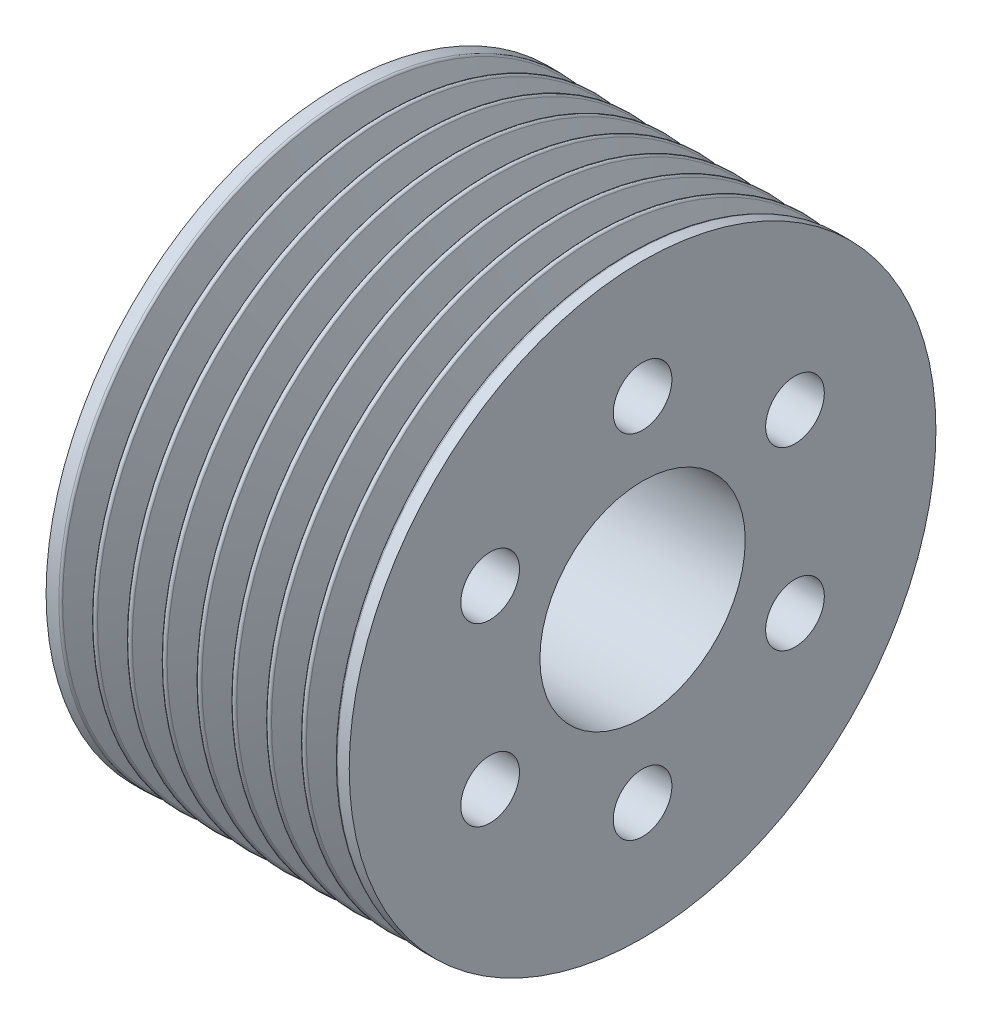
ISO-10303-21;
HEADER;
FILE_DESCRIPTION(('STEP AP214'),'2;1');
FILE_NAME('part.step','',(''),(''),'','','');
FILE_SCHEMA(('AUTOMOTIVE_DESIGN { 1 0 10303 214 1 1 1 1 }'));
ENDSEC;
DATA;
#1=APPLICATION_CONTEXT('core data for automotive mechanical design processes');
#2=APPLICATION_PROTOCOL_DEFINITION('international standard','automotive_design',2000,#1);
#3=PRODUCT_CONTEXT('',#1,'mechanical');
#4=PRODUCT('Part','Part','',(#3));
#5=PRODUCT_RELATED_PRODUCT_CATEGORY('part','',(#4));
#6=PRODUCT_DEFINITION_FORMATION('','',#4);
#7=PRODUCT_DEFINITION_CONTEXT('part definition',#1,'design');
#8=PRODUCT_DEFINITION('design','',#6,#7);
#9=PRODUCT_DEFINITION_SHAPE('','',#8);
#10=(LENGTH_UNIT() NAMED_UNIT(*) SI_UNIT(.MILLI.,.METRE.));
#11=(NAMED_UNIT(*) PLANE_ANGLE_UNIT() SI_UNIT($,.RADIAN.));
#12=(NAMED_UNIT(*) SI_UNIT($,.STERADIAN.) SOLID_ANGLE_UNIT());
#13=UNCERTAINTY_MEASURE_WITH_UNIT(LENGTH_MEASURE(1.E-05),#10,'distance_accuracy_value','');
#14=(GEOMETRIC_REPRESENTATION_CONTEXT(3) GLOBAL_UNCERTAINTY_ASSIGNED_CONTEXT((#13)) GLOBAL_UNIT_ASSIGNED_CONTEXT((#10,
#11,#12)) REPRESENTATION_CONTEXT('',''));
#15=CARTESIAN_POINT('',(0.,0.,0.));
#16=DIRECTION('',(0.,0.,1.));
#17=DIRECTION('',(1.,0.,0.));
#18=AXIS2_PLACEMENT_3D('',#15,#16,#17);
#19=CARTESIAN_POINT('',(0.,0.,0.));
#20=DIRECTION('',(-1.,0.,0.));
#21=DIRECTION('',(0.,0.,1.));
#22=AXIS2_PLACEMENT_3D('',#19,#20,#21);
#23=CYLINDRICAL_SURFACE('',#22,30.);
#24=CARTESIAN_POINT('',(18.,0.,0.));
#25=DIRECTION('',(-1.,0.,0.));
#26=DIRECTION('',(0.,0.,1.));
#27=AXIS2_PLACEMENT_3D('',#24,#25,#26);
#28=CIRCLE('',#27,30.);
#29=CARTESIAN_POINT('',(18.,0.,30.));
#30=VERTEX_POINT('',#29);
#31=EDGE_CURVE('E54',#30,#30,#28,.T.);
#32=ORIENTED_EDGE('',*,*,#31,.F.);
#33=EDGE_LOOP('',(#32));
#34=FACE_BOUND('',#33,.T.);
#35=CARTESIAN_POINT('',(19.3,0.,0.));
#36=DIRECTION('',(-1.,0.,0.));
#37=DIRECTION('',(0.,0.,1.));
#38=AXIS2_PLACEMENT_3D('',#35,#36,#37);
#39=CIRCLE('',#38,30.);
#40=CARTESIAN_POINT('',(19.3,0.,30.));
#41=VERTEX_POINT('',#40);
#42=EDGE_CURVE('E205',#41,#41,#39,.T.);
#43=ORIENTED_EDGE('',*,*,#42,.T.);
#44=EDGE_LOOP('',(#43));
#45=FACE_BOUND('',#44,.T.);
#46=ADVANCED_FACE('F41',(#34,#45),#23,.T.);
#47=CARTESIAN_POINT('',(31.5,10.5,0.));
#48=DIRECTION('',(1.,0.,0.));
#49=DIRECTION('',(0.,0.,-1.));
#50=AXIS2_PLACEMENT_3D('',#47,#48,#49);
#51=PLANE('',#50);
#52=CARTESIAN_POINT('',(31.5,8.99999999999998,15.5884572681199));
#53=DIRECTION('',(1.,0.,0.));
#54=DIRECTION('',(0.,0.,-1.));
#55=AXIS2_PLACEMENT_3D('',#52,#53,#54);
#56=CIRCLE('',#55,3.);
#57=CARTESIAN_POINT('',(31.5,8.99999999999998,12.5884572681199));
#58=VERTEX_POINT('',#57);
#59=EDGE_CURVE('E249',#58,#58,#56,.F.);
#60=ORIENTED_EDGE('',*,*,#59,.F.);
#61=EDGE_LOOP('',(#60));
#62=FACE_BOUND('',#61,.T.);
#63=CARTESIAN_POINT('',(31.5,-9.00000000000001,15.5884572681199));
#64=DIRECTION('',(1.,0.,0.));
#65=DIRECTION('',(0.,0.,-1.));
#66=AXIS2_PLACEMENT_3D('',#63,#64,#65);
#67=CIRCLE('',#66,3.);
#68=CARTESIAN_POINT('',(31.5,-9.00000000000001,12.5884572681199));
#69=VERTEX_POINT('',#68);
#70=EDGE_CURVE('E241',#69,#69,#67,.F.);
#71=ORIENTED_EDGE('',*,*,#70,.F.);
#72=EDGE_LOOP('',(#71));
#73=FACE_BOUND('',#72,.T.);
#74=CARTESIAN_POINT('',(31.5,-18.,0.));
#75=DIRECTION('',(1.,0.,0.));
#76=DIRECTION('',(0.,0.,-1.));
#77=AXIS2_PLACEMENT_3D('',#74,#75,#76);
#78=CIRCLE('',#77,3.);
#79=CARTESIAN_POINT('',(31.5,-18.,-3.00000000000001));
#80=VERTEX_POINT('',#79);
#81=EDGE_CURVE('E233',#80,#80,#78,.F.);
#82=ORIENTED_EDGE('',*,*,#81,.F.);
#83=EDGE_LOOP('',(#82));
#84=FACE_BOUND('',#83,.T.);
#85=CARTESIAN_POINT('',(31.5,-8.99999999999999,-15.5884572681199));
#86=DIRECTION('',(1.,0.,0.));
#87=DIRECTION('',(0.,0.,-1.));
#88=AXIS2_PLACEMENT_3D('',#85,#86,#87);
#89=CIRCLE('',#88,3.);
#90=CARTESIAN_POINT('',(31.5,-8.99999999999999,-18.5884572681199));
#91=VERTEX_POINT('',#90);
#92=EDGE_CURVE('E225',#91,#91,#89,.F.);
#93=ORIENTED_EDGE('',*,*,#92,.F.);
#94=EDGE_LOOP('',(#93));
#95=FACE_BOUND('',#94,.T.);
#96=CARTESIAN_POINT('',(31.5,9.00000000000001,-15.5884572681199));
#97=DIRECTION('',(1.,0.,0.));
#98=DIRECTION('',(0.,0.,-1.));
#99=AXIS2_PLACEMENT_3D('',#96,#97,#98);
#100=CIRCLE('',#99,3.);
#101=CARTESIAN_POINT('',(31.5,9.00000000000001,-18.5884572681199));
#102=VERTEX_POINT('',#101);
#103=EDGE_CURVE('E217',#102,#102,#100,.F.);
#104=ORIENTED_EDGE('',*,*,#103,.F.);
#105=EDGE_LOOP('',(#104));
#106=FACE_BOUND('',#105,.T.);
#107=CARTESIAN_POINT('',(31.5,18.,0.));
#108=DIRECTION('',(1.,0.,0.));
#109=DIRECTION('',(0.,0.,-1.));
#110=AXIS2_PLACEMENT_3D('',#107,#108,#109);
#111=CIRCLE('',#110,3.);
#112=CARTESIAN_POINT('',(31.5,18.,-3.));
#113=VERTEX_POINT('',#112);
#114=EDGE_CURVE('E209',#113,#113,#111,.F.);
#115=ORIENTED_EDGE('',*,*,#114,.F.);
#116=EDGE_LOOP('',(#115));
#117=FACE_BOUND('',#116,.T.);
#118=CARTESIAN_POINT('',(31.5,0.,0.));
#119=DIRECTION('',(-1.,0.,0.));
#120=DIRECTION('',(0.,0.,1.));
#121=AXIS2_PLACEMENT_3D('',#118,#119,#120);
#122=CIRCLE('',#121,10.5);
#123=CARTESIAN_POINT('',(31.5,0.,10.5));
#124=VERTEX_POINT('',#123);
#125=EDGE_CURVE('E69',#124,#124,#122,.T.);
#126=ORIENTED_EDGE('',*,*,#125,.F.);
#127=EDGE_LOOP('',(#126));
#128=FACE_BOUND('',#127,.T.);
#129=CARTESIAN_POINT('',(31.5,0.,0.));
#130=DIRECTION('',(-1.,0.,0.));
#131=DIRECTION('',(0.,0.,1.));
#132=AXIS2_PLACEMENT_3D('',#129,#130,#131);
#133=CIRCLE('',#132,21.5);
#134=CARTESIAN_POINT('',(31.5,0.,21.5));
#135=VERTEX_POINT('',#134);
#136=EDGE_CURVE('E10',#135,#135,#133,.T.);
#137=ORIENTED_EDGE('',*,*,#136,.T.);
#138=EDGE_LOOP('',(#137));
#139=FACE_BOUND('',#138,.T.);
#140=ADVANCED_FACE('F43',(#62,#73,#84,#95,#106,#117,#128,#139),#51,.F.);
#141=CARTESIAN_POINT('',(0.,0.,0.));
#142=DIRECTION('',(-1.,0.,0.));
#143=DIRECTION('',(0.,0.,1.));
#144=AXIS2_PLACEMENT_3D('',#141,#142,#143);
#145=CYLINDRICAL_SURFACE('',#144,21.5);
#146=ORIENTED_EDGE('',*,*,#136,.F.);
#147=EDGE_LOOP('',(#146));
#148=FACE_BOUND('',#147,.T.);
#149=CARTESIAN_POINT('',(18.,0.,0.));
#150=DIRECTION('',(-1.,0.,0.));
#151=DIRECTION('',(0.,0.,1.));
#152=AXIS2_PLACEMENT_3D('',#149,#150,#151);
#153=CIRCLE('',#152,21.5);
#154=CARTESIAN_POINT('',(18.,0.,21.5));
#155=VERTEX_POINT('',#154);
#156=EDGE_CURVE('E49',#155,#155,#153,.T.);
#157=ORIENTED_EDGE('',*,*,#156,.T.);
#158=EDGE_LOOP('',(#157));
#159=FACE_BOUND('',#158,.T.);
#160=ADVANCED_FACE('F287',(#148,#159),#145,.F.);
#161=CARTESIAN_POINT('',(18.,30.,0.));
#162=DIRECTION('',(1.,0.,0.));
#163=DIRECTION('',(0.,0.,-1.));
#164=AXIS2_PLACEMENT_3D('',#161,#162,#163);
#165=PLANE('',#164);
#166=ORIENTED_EDGE('',*,*,#156,.F.);
#167=EDGE_LOOP('',(#166));
#168=FACE_BOUND('',#167,.T.);
#169=ORIENTED_EDGE('',*,*,#31,.T.);
#170=EDGE_LOOP('',(#169));
#171=FACE_BOUND('',#170,.T.);
#172=ADVANCED_FACE('F293',(#168,#171),#165,.F.);
#173=CARTESIAN_POINT('',(47.78,0.,0.));
#174=DIRECTION('',(-1.,0.,0.));
#175=DIRECTION('',(0.,0.,1.));
#176=AXIS2_PLACEMENT_3D('',#173,#174,#175);
#177=CIRCLE('',#176,30.);
#178=CARTESIAN_POINT('',(47.78,0.,30.));
#179=VERTEX_POINT('',#178);
#180=EDGE_CURVE('E89',#179,#179,#177,.T.);
#181=ORIENTED_EDGE('',*,*,#180,.F.);
#182=EDGE_LOOP('',(#181));
#183=FACE_BOUND('',#182,.T.);
#184=CARTESIAN_POINT('',(49.,0.,0.));
#185=DIRECTION('',(-1.,0.,0.));
#186=DIRECTION('',(0.,0.,1.));
#187=AXIS2_PLACEMENT_3D('',#184,#185,#186);
#188=CIRCLE('',#187,30.);
#189=CARTESIAN_POINT('',(49.,0.,30.));
#190=VERTEX_POINT('',#189);
#191=EDGE_CURVE('E59',#190,#190,#188,.T.);
#192=ORIENTED_EDGE('',*,*,#191,.T.);
#193=EDGE_LOOP('',(#192));
#194=FACE_BOUND('',#193,.T.);
#195=ADVANCED_FACE('F264',(#183,#194),#23,.T.);
#196=CARTESIAN_POINT('',(49.,10.5,0.));
#197=DIRECTION('',(-1.,0.,0.));
#198=DIRECTION('',(0.,0.,1.));
#199=AXIS2_PLACEMENT_3D('',#196,#197,#198);
#200=PLANE('',#199);
#201=CARTESIAN_POINT('',(49.,8.99999999999998,15.5884572681199));
#202=DIRECTION('',(1.,0.,0.));
#203=DIRECTION('',(0.,0.,-1.));
#204=AXIS2_PLACEMENT_3D('',#201,#202,#203);
#205=CIRCLE('',#204,3.);
#206=CARTESIAN_POINT('',(49.,8.99999999999998,12.5884572681199));
#207=VERTEX_POINT('',#206);
#208=EDGE_CURVE('E253',#207,#207,#205,.T.);
#209=ORIENTED_EDGE('',*,*,#208,.F.);
#210=EDGE_LOOP('',(#209));
#211=FACE_BOUND('',#210,.T.);
#212=CARTESIAN_POINT('',(49.,-9.00000000000001,15.5884572681199));
#213=DIRECTION('',(1.,0.,0.));
#214=DIRECTION('',(0.,0.,-1.));
#215=AXIS2_PLACEMENT_3D('',#212,#213,#214);
#216=CIRCLE('',#215,3.);
#217=CARTESIAN_POINT('',(49.,-9.00000000000001,12.5884572681199));
#218=VERTEX_POINT('',#217);
#219=EDGE_CURVE('E245',#218,#218,#216,.T.);
#220=ORIENTED_EDGE('',*,*,#219,.F.);
#221=EDGE_LOOP('',(#220));
#222=FACE_BOUND('',#221,.T.);
#223=CARTESIAN_POINT('',(49.,-18.,0.));
#224=DIRECTION('',(1.,0.,0.));
#225=DIRECTION('',(0.,0.,-1.));
#226=AXIS2_PLACEMENT_3D('',#223,#224,#225);
#227=CIRCLE('',#226,3.);
#228=CARTESIAN_POINT('',(49.,-18.,-3.00000000000001));
#229=VERTEX_POINT('',#228);
#230=EDGE_CURVE('E237',#229,#229,#227,.T.);
#231=ORIENTED_EDGE('',*,*,#230,.F.);
#232=EDGE_LOOP('',(#231));
#233=FACE_BOUND('',#232,.T.);
#234=CARTESIAN_POINT('',(49.,-8.99999999999999,-15.5884572681199));
#235=DIRECTION('',(1.,0.,0.));
#236=DIRECTION('',(0.,0.,-1.));
#237=AXIS2_PLACEMENT_3D('',#234,#235,#236);
#238=CIRCLE('',#237,3.);
#239=CARTESIAN_POINT('',(49.,-8.99999999999999,-18.5884572681199));
#240=VERTEX_POINT('',#239);
#241=EDGE_CURVE('E229',#240,#240,#238,.T.);
#242=ORIENTED_EDGE('',*,*,#241,.F.);
#243=EDGE_LOOP('',(#242));
#244=FACE_BOUND('',#243,.T.);
#245=CARTESIAN_POINT('',(49.,9.00000000000001,-15.5884572681199));
#246=DIRECTION('',(1.,0.,0.));
#247=DIRECTION('',(0.,0.,-1.));
#248=AXIS2_PLACEMENT_3D('',#245,#246,#247);
#249=CIRCLE('',#248,3.);
#250=CARTESIAN_POINT('',(49.,9.00000000000001,-18.5884572681199));
#251=VERTEX_POINT('',#250);
#252=EDGE_CURVE('E221',#251,#251,#249,.T.);
#253=ORIENTED_EDGE('',*,*,#252,.F.);
#254=EDGE_LOOP('',(#253));
#255=FACE_BOUND('',#254,.T.);
#256=CARTESIAN_POINT('',(49.,18.,0.));
#257=DIRECTION('',(1.,0.,0.));
#258=DIRECTION('',(0.,0.,-1.));
#259=AXIS2_PLACEMENT_3D('',#256,#257,#258);
#260=CIRCLE('',#259,3.);
#261=CARTESIAN_POINT('',(49.,18.,-3.));
#262=VERTEX_POINT('',#261);
#263=EDGE_CURVE('E213',#262,#262,#260,.T.);
#264=ORIENTED_EDGE('',*,*,#263,.F.);
#265=EDGE_LOOP('',(#264));
#266=FACE_BOUND('',#265,.T.);
#267=ORIENTED_EDGE('',*,*,#191,.F.);
#268=EDGE_LOOP('',(#267));
#269=FACE_BOUND('',#268,.T.);
#270=CARTESIAN_POINT('',(49.,0.,0.));
#271=DIRECTION('',(-1.,0.,0.));
#272=DIRECTION('',(0.,0.,1.));
#273=AXIS2_PLACEMENT_3D('',#270,#271,#272);
#274=CIRCLE('',#273,10.5);
#275=CARTESIAN_POINT('',(49.,0.,10.5));
#276=VERTEX_POINT('',#275);
#277=EDGE_CURVE('E65',#276,#276,#274,.T.);
#278=ORIENTED_EDGE('',*,*,#277,.T.);
#279=EDGE_LOOP('',(#278));
#280=FACE_BOUND('',#279,.T.);
#281=ADVANCED_FACE('F260',(#211,#222,#233,#244,#255,#266,#269,#280),#200,.F.);
#282=CARTESIAN_POINT('',(0.,0.,0.));
#283=DIRECTION('',(-1.,0.,0.));
#284=DIRECTION('',(0.,0.,1.));
#285=AXIS2_PLACEMENT_3D('',#282,#283,#284);
#286=CYLINDRICAL_SURFACE('',#285,10.5);
#287=ORIENTED_EDGE('',*,*,#277,.F.);
#288=EDGE_LOOP('',(#287));
#289=FACE_BOUND('',#288,.T.);
#290=ORIENTED_EDGE('',*,*,#125,.T.);
#291=EDGE_LOOP('',(#290));
#292=FACE_BOUND('',#291,.T.);
#293=ADVANCED_FACE('F263',(#289,#292),#286,.F.);
#294=CARTESIAN_POINT('',(47.78,0.,0.));
#295=DIRECTION('',(-1.,0.,0.));
#296=DIRECTION('',(0.,0.,1.));
#297=AXIS2_PLACEMENT_3D('',#294,#295,#296);
#298=TOROIDAL_SURFACE('',#297,29.75,0.249999999999997);
#299=ORIENTED_EDGE('',*,*,#180,.T.);
#300=EDGE_LOOP('',(#299));
#301=FACE_BOUND('',#300,.T.);
#302=CARTESIAN_POINT('',(47.5458319526879,0.,0.));
#303=DIRECTION('',(-1.,0.,0.));
#304=DIRECTION('',(0.,0.,1.));
#305=AXIS2_PLACEMENT_3D('',#302,#303,#304);
#306=CIRCLE('',#305,29.8375518453149);
#307=CARTESIAN_POINT('',(47.5458319526879,0.,29.8375518453149));
#308=VERTEX_POINT('',#307);
#309=EDGE_CURVE('E73',#308,#308,#306,.T.);
#310=ORIENTED_EDGE('',*,*,#309,.F.);
#311=EDGE_LOOP('',(#310));
#312=FACE_BOUND('',#311,.T.);
#313=ADVANCED_FACE('F282',(#301,#312),#298,.T.);
#314=CARTESIAN_POINT('',(46.2810016567745,0.,0.));
#315=DIRECTION('',(1.,0.,0.));
#316=DIRECTION('',(0.,0.,-1.));
#317=AXIS2_PLACEMENT_3D('',#314,#315,#316);
#318=CONICAL_SURFACE('',#317,26.4546095496951,1.21300383013606);
#319=ORIENTED_EDGE('',*,*,#309,.T.);
#320=EDGE_LOOP('',(#319));
#321=FACE_BOUND('',#320,.T.);
#322=CARTESIAN_POINT('',(46.2810016567745,0.,0.));
#323=DIRECTION('',(-1.,0.,0.));
#324=DIRECTION('',(0.,0.,1.));
#325=AXIS2_PLACEMENT_3D('',#322,#323,#324);
#326=CIRCLE('',#325,26.4546095496951);
#327=CARTESIAN_POINT('',(46.2810016567745,0.,26.4546095496951));
#328=VERTEX_POINT('',#327);
#329=EDGE_CURVE('E77',#328,#328,#326,.T.);
#330=ORIENTED_EDGE('',*,*,#329,.F.);
#331=EDGE_LOOP('',(#330));
#332=FACE_BOUND('',#331,.T.);
#333=ADVANCED_FACE('F445',(#321,#332),#318,.T.);
#334=CARTESIAN_POINT('',(46.,0.,0.));
#335=DIRECTION('',(-1.,0.,0.));
#336=DIRECTION('',(0.,0.,1.));
#337=AXIS2_PLACEMENT_3D('',#334,#335,#336);
#338=TOROIDAL_SURFACE('',#337,26.5596717640729,0.300000000000001);
#339=ORIENTED_EDGE('',*,*,#329,.T.);
#340=EDGE_LOOP('',(#339));
#341=FACE_BOUND('',#340,.T.);
#342=CARTESIAN_POINT('',(45.7189983432255,0.,0.));
#343=DIRECTION('',(-1.,0.,0.));
#344=DIRECTION('',(0.,0.,1.));
#345=AXIS2_PLACEMENT_3D('',#342,#343,#344);
#346=CIRCLE('',#345,26.4546095496951);
#347=CARTESIAN_POINT('',(45.7189983432255,0.,26.4546095496951));
#348=VERTEX_POINT('',#347);
#349=EDGE_CURVE('E81',#348,#348,#346,.T.);
#350=ORIENTED_EDGE('',*,*,#349,.F.);
#351=EDGE_LOOP('',(#350));
#352=FACE_BOUND('',#351,.T.);
#353=ADVANCED_FACE('F441',(#341,#352),#338,.F.);
#354=CARTESIAN_POINT('',(44.4541680473121,0.,0.));
#355=DIRECTION('',(-1.,0.,0.));
#356=DIRECTION('',(0.,0.,1.));
#357=AXIS2_PLACEMENT_3D('',#354,#355,#356);
#358=CONICAL_SURFACE('',#357,29.8375518453149,1.21300383013606);
#359=ORIENTED_EDGE('',*,*,#349,.T.);
#360=EDGE_LOOP('',(#359));
#361=FACE_BOUND('',#360,.T.);
#362=CARTESIAN_POINT('',(44.4541680473121,0.,0.));
#363=DIRECTION('',(-1.,0.,0.));
#364=DIRECTION('',(0.,0.,1.));
#365=AXIS2_PLACEMENT_3D('',#362,#363,#364);
#366=CIRCLE('',#365,29.8375518453149);
#367=CARTESIAN_POINT('',(44.4541680473121,0.,29.8375518453149));
#368=VERTEX_POINT('',#367);
#369=EDGE_CURVE('E85',#368,#368,#366,.T.);
#370=ORIENTED_EDGE('',*,*,#369,.F.);
#371=EDGE_LOOP('',(#370));
#372=FACE_BOUND('',#371,.T.);
#373=ADVANCED_FACE('F437',(#361,#372),#358,.T.);
#374=CARTESIAN_POINT('',(44.22,0.,0.));
#375=DIRECTION('',(-1.,0.,0.));
#376=DIRECTION('',(0.,0.,1.));
#377=AXIS2_PLACEMENT_3D('',#374,#375,#376);
#378=TOROIDAL_SURFACE('',#377,29.75,0.250000000000004);
#379=ORIENTED_EDGE('',*,*,#369,.T.);
#380=EDGE_LOOP('',(#379));
#381=FACE_BOUND('',#380,.T.);
#382=CARTESIAN_POINT('',(43.9858319526879,0.,0.));
#383=DIRECTION('',(-1.,0.,0.));
#384=DIRECTION('',(0.,0.,1.));
#385=AXIS2_PLACEMENT_3D('',#382,#383,#384);
#386=CIRCLE('',#385,29.8375518453149);
#387=CARTESIAN_POINT('',(43.9858319526879,0.,29.8375518453149));
#388=VERTEX_POINT('',#387);
#389=EDGE_CURVE('E93',#388,#388,#386,.T.);
#390=ORIENTED_EDGE('',*,*,#389,.F.);
#391=EDGE_LOOP('',(#390));
#392=FACE_BOUND('',#391,.T.);
#393=ADVANCED_FACE('F433',(#381,#392),#378,.T.);
#394=CARTESIAN_POINT('',(42.7210016567745,0.,0.));
#395=DIRECTION('',(1.,0.,0.));
#396=DIRECTION('',(0.,0.,-1.));
#397=AXIS2_PLACEMENT_3D('',#394,#395,#396);
#398=CONICAL_SURFACE('',#397,26.4546095496951,1.21300383013606);
#399=ORIENTED_EDGE('',*,*,#389,.T.);
#400=EDGE_LOOP('',(#399));
#401=FACE_BOUND('',#400,.T.);
#402=CARTESIAN_POINT('',(42.7210016567745,0.,0.));
#403=DIRECTION('',(-1.,0.,0.));
#404=DIRECTION('',(0.,0.,1.));
#405=AXIS2_PLACEMENT_3D('',#402,#403,#404);
#406=CIRCLE('',#405,26.4546095496951);
#407=CARTESIAN_POINT('',(42.7210016567745,0.,26.4546095496951));
#408=VERTEX_POINT('',#407);
#409=EDGE_CURVE('E97',#408,#408,#406,.T.);
#410=ORIENTED_EDGE('',*,*,#409,.F.);
#411=EDGE_LOOP('',(#410));
#412=FACE_BOUND('',#411,.T.);
#413=ADVANCED_FACE('F429',(#401,#412),#398,.T.);
#414=CARTESIAN_POINT('',(42.44,0.,0.));
#415=DIRECTION('',(-1.,0.,0.));
#416=DIRECTION('',(0.,0.,1.));
#417=AXIS2_PLACEMENT_3D('',#414,#415,#416);
#418=TOROIDAL_SURFACE('',#417,26.5596717640729,0.300000000000001);
#419=ORIENTED_EDGE('',*,*,#409,.T.);
#420=EDGE_LOOP('',(#419));
#421=FACE_BOUND('',#420,.T.);
#422=CARTESIAN_POINT('',(42.1589983432255,0.,0.));
#423=DIRECTION('',(-1.,0.,0.));
#424=DIRECTION('',(0.,0.,1.));
#425=AXIS2_PLACEMENT_3D('',#422,#423,#424);
#426=CIRCLE('',#425,26.4546095496951);
#427=CARTESIAN_POINT('',(42.1589983432255,0.,26.4546095496951));
#428=VERTEX_POINT('',#427);
#429=EDGE_CURVE('E101',#428,#428,#426,.T.);
#430=ORIENTED_EDGE('',*,*,#429,.F.);
#431=EDGE_LOOP('',(#430));
#432=FACE_BOUND('',#431,.T.);
#433=ADVANCED_FACE('F425',(#421,#432),#418,.F.);
#434=CARTESIAN_POINT('',(40.8941680473121,0.,0.));
#435=DIRECTION('',(-1.,0.,0.));
#436=DIRECTION('',(0.,0.,1.));
#437=AXIS2_PLACEMENT_3D('',#434,#435,#436);
#438=CONICAL_SURFACE('',#437,29.8375518453149,1.21300383013606);
#439=ORIENTED_EDGE('',*,*,#429,.T.);
#440=EDGE_LOOP('',(#439));
#441=FACE_BOUND('',#440,.T.);
#442=CARTESIAN_POINT('',(40.8941680473121,0.,0.));
#443=DIRECTION('',(-1.,0.,0.));
#444=DIRECTION('',(0.,0.,1.));
#445=AXIS2_PLACEMENT_3D('',#442,#443,#444);
#446=CIRCLE('',#445,29.8375518453149);
#447=CARTESIAN_POINT('',(40.8941680473121,0.,29.8375518453149));
#448=VERTEX_POINT('',#447);
#449=EDGE_CURVE('E105',#448,#448,#446,.T.);
#450=ORIENTED_EDGE('',*,*,#449,.F.);
#451=EDGE_LOOP('',(#450));
#452=FACE_BOUND('',#451,.T.);
#453=ADVANCED_FACE('F421',(#441,#452),#438,.T.);
#454=CARTESIAN_POINT('',(40.66,0.,0.));
#455=DIRECTION('',(-1.,0.,0.));
#456=DIRECTION('',(0.,0.,1.));
#457=AXIS2_PLACEMENT_3D('',#454,#455,#456);
#458=TOROIDAL_SURFACE('',#457,29.75,0.250000000000004);
#459=ORIENTED_EDGE('',*,*,#449,.T.);
#460=EDGE_LOOP('',(#459));
#461=FACE_BOUND('',#460,.T.);
#462=CARTESIAN_POINT('',(40.4258319526879,0.,0.));
#463=DIRECTION('',(-1.,0.,0.));
#464=DIRECTION('',(0.,0.,1.));
#465=AXIS2_PLACEMENT_3D('',#462,#463,#464);
#466=CIRCLE('',#465,29.8375518453149);
#467=CARTESIAN_POINT('',(40.4258319526879,0.,29.8375518453149));
#468=VERTEX_POINT('',#467);
#469=EDGE_CURVE('E109',#468,#468,#466,.T.);
#470=ORIENTED_EDGE('',*,*,#469,.F.);
#471=EDGE_LOOP('',(#470));
#472=FACE_BOUND('',#471,.T.);
#473=ADVANCED_FACE('F417',(#461,#472),#458,.T.);
#474=CARTESIAN_POINT('',(39.1610016567745,0.,0.));
#475=DIRECTION('',(1.,0.,0.));
#476=DIRECTION('',(0.,0.,-1.));
#477=AXIS2_PLACEMENT_3D('',#474,#475,#476);
#478=CONICAL_SURFACE('',#477,26.4546095496951,1.21300383013606);
#479=ORIENTED_EDGE('',*,*,#469,.T.);
#480=EDGE_LOOP('',(#479));
#481=FACE_BOUND('',#480,.T.);
#482=CARTESIAN_POINT('',(39.1610016567745,0.,0.));
#483=DIRECTION('',(-1.,0.,0.));
#484=DIRECTION('',(0.,0.,1.));
#485=AXIS2_PLACEMENT_3D('',#482,#483,#484);
#486=CIRCLE('',#485,26.4546095496951);
#487=CARTESIAN_POINT('',(39.1610016567745,0.,26.4546095496951));
#488=VERTEX_POINT('',#487);
#489=EDGE_CURVE('E113',#488,#488,#486,.T.);
#490=ORIENTED_EDGE('',*,*,#489,.F.);
#491=EDGE_LOOP('',(#490));
#492=FACE_BOUND('',#491,.T.);
#493=ADVANCED_FACE('F413',(#481,#492),#478,.T.);
#494=CARTESIAN_POINT('',(38.88,0.,0.));
#495=DIRECTION('',(-1.,0.,0.));
#496=DIRECTION('',(0.,0.,1.));
#497=AXIS2_PLACEMENT_3D('',#494,#495,#496);
#498=TOROIDAL_SURFACE('',#497,26.5596717640729,0.300000000000001);
#499=ORIENTED_EDGE('',*,*,#489,.T.);
#500=EDGE_LOOP('',(#499));
#501=FACE_BOUND('',#500,.T.);
#502=CARTESIAN_POINT('',(38.5989983432255,0.,0.));
#503=DIRECTION('',(-1.,0.,0.));
#504=DIRECTION('',(0.,0.,1.));
#505=AXIS2_PLACEMENT_3D('',#502,#503,#504);
#506=CIRCLE('',#505,26.4546095496951);
#507=CARTESIAN_POINT('',(38.5989983432255,0.,26.4546095496951));
#508=VERTEX_POINT('',#507);
#509=EDGE_CURVE('E117',#508,#508,#506,.T.);
#510=ORIENTED_EDGE('',*,*,#509,.F.);
#511=EDGE_LOOP('',(#510));
#512=FACE_BOUND('',#511,.T.);
#513=ADVANCED_FACE('F409',(#501,#512),#498,.F.);
#514=CARTESIAN_POINT('',(37.3341680473121,0.,0.));
#515=DIRECTION('',(-1.,0.,0.));
#516=DIRECTION('',(0.,0.,1.));
#517=AXIS2_PLACEMENT_3D('',#514,#515,#516);
#518=CONICAL_SURFACE('',#517,29.8375518453149,1.21300383013606);
#519=ORIENTED_EDGE('',*,*,#509,.T.);
#520=EDGE_LOOP('',(#519));
#521=FACE_BOUND('',#520,.T.);
#522=CARTESIAN_POINT('',(37.3341680473121,0.,0.));
#523=DIRECTION('',(-1.,0.,0.));
#524=DIRECTION('',(0.,0.,1.));
#525=AXIS2_PLACEMENT_3D('',#522,#523,#524);
#526=CIRCLE('',#525,29.8375518453149);
#527=CARTESIAN_POINT('',(37.3341680473121,0.,29.8375518453149));
#528=VERTEX_POINT('',#527);
#529=EDGE_CURVE('E121',#528,#528,#526,.T.);
#530=ORIENTED_EDGE('',*,*,#529,.F.);
#531=EDGE_LOOP('',(#530));
#532=FACE_BOUND('',#531,.T.);
#533=ADVANCED_FACE('F405',(#521,#532),#518,.T.);
#534=CARTESIAN_POINT('',(37.1,0.,0.));
#535=DIRECTION('',(-1.,0.,0.));
#536=DIRECTION('',(0.,0.,1.));
#537=AXIS2_PLACEMENT_3D('',#534,#535,#536);
#538=TOROIDAL_SURFACE('',#537,29.75,0.250000000000004);
#539=ORIENTED_EDGE('',*,*,#529,.T.);
#540=EDGE_LOOP('',(#539));
#541=FACE_BOUND('',#540,.T.);
#542=CARTESIAN_POINT('',(36.8658319526879,0.,0.));
#543=DIRECTION('',(-1.,0.,0.));
#544=DIRECTION('',(0.,0.,1.));
#545=AXIS2_PLACEMENT_3D('',#542,#543,#544);
#546=CIRCLE('',#545,29.8375518453149);
#547=CARTESIAN_POINT('',(36.8658319526879,0.,29.8375518453149));
#548=VERTEX_POINT('',#547);
#549=EDGE_CURVE('E125',#548,#548,#546,.T.);
#550=ORIENTED_EDGE('',*,*,#549,.F.);
#551=EDGE_LOOP('',(#550));
#552=FACE_BOUND('',#551,.T.);
#553=ADVANCED_FACE('F401',(#541,#552),#538,.T.);
#554=CARTESIAN_POINT('',(35.6010016567745,0.,0.));
#555=DIRECTION('',(1.,0.,0.));
#556=DIRECTION('',(0.,0.,-1.));
#557=AXIS2_PLACEMENT_3D('',#554,#555,#556);
#558=CONICAL_SURFACE('',#557,26.4546095496951,1.21300383013606);
#559=ORIENTED_EDGE('',*,*,#549,.T.);
#560=EDGE_LOOP('',(#559));
#561=FACE_BOUND('',#560,.T.);
#562=CARTESIAN_POINT('',(35.6010016567745,0.,0.));
#563=DIRECTION('',(-1.,0.,0.));
#564=DIRECTION('',(0.,0.,1.));
#565=AXIS2_PLACEMENT_3D('',#562,#563,#564);
#566=CIRCLE('',#565,26.4546095496951);
#567=CARTESIAN_POINT('',(35.6010016567745,0.,26.4546095496951));
#568=VERTEX_POINT('',#567);
#569=EDGE_CURVE('E129',#568,#568,#566,.T.);
#570=ORIENTED_EDGE('',*,*,#569,.F.);
#571=EDGE_LOOP('',(#570));
#572=FACE_BOUND('',#571,.T.);
#573=ADVANCED_FACE('F397',(#561,#572),#558,.T.);
#574=CARTESIAN_POINT('',(35.32,0.,0.));
#575=DIRECTION('',(-1.,0.,0.));
#576=DIRECTION('',(0.,0.,1.));
#577=AXIS2_PLACEMENT_3D('',#574,#575,#576);
#578=TOROIDAL_SURFACE('',#577,26.5596717640729,0.300000000000001);
#579=ORIENTED_EDGE('',*,*,#569,.T.);
#580=EDGE_LOOP('',(#579));
#581=FACE_BOUND('',#580,.T.);
#582=CARTESIAN_POINT('',(35.0389983432255,0.,0.));
#583=DIRECTION('',(-1.,0.,0.));
#584=DIRECTION('',(0.,0.,1.));
#585=AXIS2_PLACEMENT_3D('',#582,#583,#584);
#586=CIRCLE('',#585,26.4546095496951);
#587=CARTESIAN_POINT('',(35.0389983432255,0.,26.4546095496951));
#588=VERTEX_POINT('',#587);
#589=EDGE_CURVE('E133',#588,#588,#586,.T.);
#590=ORIENTED_EDGE('',*,*,#589,.F.);
#591=EDGE_LOOP('',(#590));
#592=FACE_BOUND('',#591,.T.);
#593=ADVANCED_FACE('F393',(#581,#592),#578,.F.);
#594=CARTESIAN_POINT('',(33.7741680473121,0.,0.));
#595=DIRECTION('',(-1.,0.,0.));
#596=DIRECTION('',(0.,0.,1.));
#597=AXIS2_PLACEMENT_3D('',#594,#595,#596);
#598=CONICAL_SURFACE('',#597,29.8375518453149,1.21300383013606);
#599=ORIENTED_EDGE('',*,*,#589,.T.);
#600=EDGE_LOOP('',(#599));
#601=FACE_BOUND('',#600,.T.);
#602=CARTESIAN_POINT('',(33.7741680473121,0.,0.));
#603=DIRECTION('',(-1.,0.,0.));
#604=DIRECTION('',(0.,0.,1.));
#605=AXIS2_PLACEMENT_3D('',#602,#603,#604);
#606=CIRCLE('',#605,29.8375518453149);
#607=CARTESIAN_POINT('',(33.7741680473121,0.,29.8375518453149));
#608=VERTEX_POINT('',#607);
#609=EDGE_CURVE('E137',#608,#608,#606,.T.);
#610=ORIENTED_EDGE('',*,*,#609,.F.);
#611=EDGE_LOOP('',(#610));
#612=FACE_BOUND('',#611,.T.);
#613=ADVANCED_FACE('F389',(#601,#612),#598,.T.);
#614=CARTESIAN_POINT('',(33.54,0.,0.));
#615=DIRECTION('',(-1.,0.,0.));
#616=DIRECTION('',(0.,0.,1.));
#617=AXIS2_PLACEMENT_3D('',#614,#615,#616);
#618=TOROIDAL_SURFACE('',#617,29.75,0.250000000000004);
#619=ORIENTED_EDGE('',*,*,#609,.T.);
#620=EDGE_LOOP('',(#619));
#621=FACE_BOUND('',#620,.T.);
#622=CARTESIAN_POINT('',(33.3058319526879,0.,0.));
#623=DIRECTION('',(-1.,0.,0.));
#624=DIRECTION('',(0.,0.,1.));
#625=AXIS2_PLACEMENT_3D('',#622,#623,#624);
#626=CIRCLE('',#625,29.8375518453149);
#627=CARTESIAN_POINT('',(33.3058319526879,0.,29.8375518453149));
#628=VERTEX_POINT('',#627);
#629=EDGE_CURVE('E141',#628,#628,#626,.T.);
#630=ORIENTED_EDGE('',*,*,#629,.F.);
#631=EDGE_LOOP('',(#630));
#632=FACE_BOUND('',#631,.T.);
#633=ADVANCED_FACE('F385',(#621,#632),#618,.T.);
#634=CARTESIAN_POINT('',(32.0410016567745,0.,0.));
#635=DIRECTION('',(1.,0.,0.));
#636=DIRECTION('',(0.,0.,-1.));
#637=AXIS2_PLACEMENT_3D('',#634,#635,#636);
#638=CONICAL_SURFACE('',#637,26.4546095496951,1.21300383013606);
#639=ORIENTED_EDGE('',*,*,#629,.T.);
#640=EDGE_LOOP('',(#639));
#641=FACE_BOUND('',#640,.T.);
#642=CARTESIAN_POINT('',(32.0410016567745,0.,0.));
#643=DIRECTION('',(-1.,0.,0.));
#644=DIRECTION('',(0.,0.,1.));
#645=AXIS2_PLACEMENT_3D('',#642,#643,#644);
#646=CIRCLE('',#645,26.4546095496951);
#647=CARTESIAN_POINT('',(32.0410016567745,0.,26.4546095496951));
#648=VERTEX_POINT('',#647);
#649=EDGE_CURVE('E145',#648,#648,#646,.T.);
#650=ORIENTED_EDGE('',*,*,#649,.F.);
#651=EDGE_LOOP('',(#650));
#652=FACE_BOUND('',#651,.T.);
#653=ADVANCED_FACE('F381',(#641,#652),#638,.T.);
#654=CARTESIAN_POINT('',(31.76,0.,0.));
#655=DIRECTION('',(-1.,0.,0.));
#656=DIRECTION('',(0.,0.,1.));
#657=AXIS2_PLACEMENT_3D('',#654,#655,#656);
#658=TOROIDAL_SURFACE('',#657,26.5596717640729,0.300000000000001);
#659=ORIENTED_EDGE('',*,*,#649,.T.);
#660=EDGE_LOOP('',(#659));
#661=FACE_BOUND('',#660,.T.);
#662=CARTESIAN_POINT('',(31.4789983432255,0.,0.));
#663=DIRECTION('',(-1.,0.,0.));
#664=DIRECTION('',(0.,0.,1.));
#665=AXIS2_PLACEMENT_3D('',#662,#663,#664);
#666=CIRCLE('',#665,26.4546095496951);
#667=CARTESIAN_POINT('',(31.4789983432255,0.,26.4546095496951));
#668=VERTEX_POINT('',#667);
#669=EDGE_CURVE('E149',#668,#668,#666,.T.);
#670=ORIENTED_EDGE('',*,*,#669,.F.);
#671=EDGE_LOOP('',(#670));
#672=FACE_BOUND('',#671,.T.);
#673=ADVANCED_FACE('F377',(#661,#672),#658,.F.);
#674=CARTESIAN_POINT('',(30.2141680473121,0.,0.));
#675=DIRECTION('',(-1.,0.,0.));
#676=DIRECTION('',(0.,0.,1.));
#677=AXIS2_PLACEMENT_3D('',#674,#675,#676);
#678=CONICAL_SURFACE('',#677,29.8375518453149,1.21300383013606);
#679=ORIENTED_EDGE('',*,*,#669,.T.);
#680=EDGE_LOOP('',(#679));
#681=FACE_BOUND('',#680,.T.);
#682=CARTESIAN_POINT('',(30.2141680473121,0.,0.));
#683=DIRECTION('',(-1.,0.,0.));
#684=DIRECTION('',(0.,0.,1.));
#685=AXIS2_PLACEMENT_3D('',#682,#683,#684);
#686=CIRCLE('',#685,29.8375518453149);
#687=CARTESIAN_POINT('',(30.2141680473121,0.,29.8375518453149));
#688=VERTEX_POINT('',#687);
#689=EDGE_CURVE('E153',#688,#688,#686,.T.);
#690=ORIENTED_EDGE('',*,*,#689,.F.);
#691=EDGE_LOOP('',(#690));
#692=FACE_BOUND('',#691,.T.);
#693=ADVANCED_FACE('F373',(#681,#692),#678,.T.);
#694=CARTESIAN_POINT('',(29.98,0.,0.));
#695=DIRECTION('',(-1.,0.,0.));
#696=DIRECTION('',(0.,0.,1.));
#697=AXIS2_PLACEMENT_3D('',#694,#695,#696);
#698=TOROIDAL_SURFACE('',#697,29.75,0.250000000000004);
#699=ORIENTED_EDGE('',*,*,#689,.T.);
#700=EDGE_LOOP('',(#699));
#701=FACE_BOUND('',#700,.T.);
#702=CARTESIAN_POINT('',(29.7458319526879,0.,0.));
#703=DIRECTION('',(-1.,0.,0.));
#704=DIRECTION('',(0.,0.,1.));
#705=AXIS2_PLACEMENT_3D('',#702,#703,#704);
#706=CIRCLE('',#705,29.8375518453149);
#707=CARTESIAN_POINT('',(29.7458319526879,0.,29.8375518453149));
#708=VERTEX_POINT('',#707);
#709=EDGE_CURVE('E157',#708,#708,#706,.T.);
#710=ORIENTED_EDGE('',*,*,#709,.F.);
#711=EDGE_LOOP('',(#710));
#712=FACE_BOUND('',#711,.T.);
#713=ADVANCED_FACE('F369',(#701,#712),#698,.T.);
#714=CARTESIAN_POINT('',(28.4810016567745,0.,0.));
#715=DIRECTION('',(1.,0.,0.));
#716=DIRECTION('',(0.,0.,-1.));
#717=AXIS2_PLACEMENT_3D('',#714,#715,#716);
#718=CONICAL_SURFACE('',#717,26.4546095496951,1.21300383013606);
#719=ORIENTED_EDGE('',*,*,#709,.T.);
#720=EDGE_LOOP('',(#719));
#721=FACE_BOUND('',#720,.T.);
#722=CARTESIAN_POINT('',(28.4810016567745,0.,0.));
#723=DIRECTION('',(-1.,0.,0.));
#724=DIRECTION('',(0.,0.,1.));
#725=AXIS2_PLACEMENT_3D('',#722,#723,#724);
#726=CIRCLE('',#725,26.4546095496951);
#727=CARTESIAN_POINT('',(28.4810016567745,0.,26.4546095496951));
#728=VERTEX_POINT('',#727);
#729=EDGE_CURVE('E161',#728,#728,#726,.T.);
#730=ORIENTED_EDGE('',*,*,#729,.F.);
#731=EDGE_LOOP('',(#730));
#732=FACE_BOUND('',#731,.T.);
#733=ADVANCED_FACE('F365',(#721,#732),#718,.T.);
#734=CARTESIAN_POINT('',(28.2,0.,0.));
#735=DIRECTION('',(-1.,0.,0.));
#736=DIRECTION('',(0.,0.,1.));
#737=AXIS2_PLACEMENT_3D('',#734,#735,#736);
#738=TOROIDAL_SURFACE('',#737,26.5596717640729,0.300000000000001);
#739=ORIENTED_EDGE('',*,*,#729,.T.);
#740=EDGE_LOOP('',(#739));
#741=FACE_BOUND('',#740,.T.);
#742=CARTESIAN_POINT('',(27.9189983432255,0.,0.));
#743=DIRECTION('',(-1.,0.,0.));
#744=DIRECTION('',(0.,0.,1.));
#745=AXIS2_PLACEMENT_3D('',#742,#743,#744);
#746=CIRCLE('',#745,26.4546095496951);
#747=CARTESIAN_POINT('',(27.9189983432255,0.,26.4546095496951));
#748=VERTEX_POINT('',#747);
#749=EDGE_CURVE('E165',#748,#748,#746,.T.);
#750=ORIENTED_EDGE('',*,*,#749,.F.);
#751=EDGE_LOOP('',(#750));
#752=FACE_BOUND('',#751,.T.);
#753=ADVANCED_FACE('F361',(#741,#752),#738,.F.);
#754=CARTESIAN_POINT('',(26.6541680473121,0.,0.));
#755=DIRECTION('',(-1.,0.,0.));
#756=DIRECTION('',(0.,0.,1.));
#757=AXIS2_PLACEMENT_3D('',#754,#755,#756);
#758=CONICAL_SURFACE('',#757,29.8375518453149,1.21300383013606);
#759=ORIENTED_EDGE('',*,*,#749,.T.);
#760=EDGE_LOOP('',(#759));
#761=FACE_BOUND('',#760,.T.);
#762=CARTESIAN_POINT('',(26.6541680473121,0.,0.));
#763=DIRECTION('',(-1.,0.,0.));
#764=DIRECTION('',(0.,0.,1.));
#765=AXIS2_PLACEMENT_3D('',#762,#763,#764);
#766=CIRCLE('',#765,29.8375518453149);
#767=CARTESIAN_POINT('',(26.6541680473121,0.,29.8375518453149));
#768=VERTEX_POINT('',#767);
#769=EDGE_CURVE('E169',#768,#768,#766,.T.);
#770=ORIENTED_EDGE('',*,*,#769,.F.);
#771=EDGE_LOOP('',(#770));
#772=FACE_BOUND('',#771,.T.);
#773=ADVANCED_FACE('F357',(#761,#772),#758,.T.);
#774=CARTESIAN_POINT('',(26.42,0.,0.));
#775=DIRECTION('',(-1.,0.,0.));
#776=DIRECTION('',(0.,0.,1.));
#777=AXIS2_PLACEMENT_3D('',#774,#775,#776);
#778=TOROIDAL_SURFACE('',#777,29.75,0.250000000000004);
#779=ORIENTED_EDGE('',*,*,#769,.T.);
#780=EDGE_LOOP('',(#779));
#781=FACE_BOUND('',#780,.T.);
#782=CARTESIAN_POINT('',(26.1858319526879,0.,0.));
#783=DIRECTION('',(-1.,0.,0.));
#784=DIRECTION('',(0.,0.,1.));
#785=AXIS2_PLACEMENT_3D('',#782,#783,#784);
#786=CIRCLE('',#785,29.8375518453149);
#787=CARTESIAN_POINT('',(26.1858319526879,0.,29.8375518453149));
#788=VERTEX_POINT('',#787);
#789=EDGE_CURVE('E173',#788,#788,#786,.T.);
#790=ORIENTED_EDGE('',*,*,#789,.F.);
#791=EDGE_LOOP('',(#790));
#792=FACE_BOUND('',#791,.T.);
#793=ADVANCED_FACE('F353',(#781,#792),#778,.T.);
#794=CARTESIAN_POINT('',(24.9210016567745,0.,0.));
#795=DIRECTION('',(1.,0.,0.));
#796=DIRECTION('',(0.,0.,-1.));
#797=AXIS2_PLACEMENT_3D('',#794,#795,#796);
#798=CONICAL_SURFACE('',#797,26.4546095496951,1.21300383013606);
#799=ORIENTED_EDGE('',*,*,#789,.T.);
#800=EDGE_LOOP('',(#799));
#801=FACE_BOUND('',#800,.T.);
#802=CARTESIAN_POINT('',(24.9210016567745,0.,0.));
#803=DIRECTION('',(-1.,0.,0.));
#804=DIRECTION('',(0.,0.,1.));
#805=AXIS2_PLACEMENT_3D('',#802,#803,#804);
#806=CIRCLE('',#805,26.4546095496951);
#807=CARTESIAN_POINT('',(24.9210016567745,0.,26.4546095496951));
#808=VERTEX_POINT('',#807);
#809=EDGE_CURVE('E177',#808,#808,#806,.T.);
#810=ORIENTED_EDGE('',*,*,#809,.F.);
#811=EDGE_LOOP('',(#810));
#812=FACE_BOUND('',#811,.T.);
#813=ADVANCED_FACE('F349',(#801,#812),#798,.T.);
#814=CARTESIAN_POINT('',(24.64,0.,0.));
#815=DIRECTION('',(-1.,0.,0.));
#816=DIRECTION('',(0.,0.,1.));
#817=AXIS2_PLACEMENT_3D('',#814,#815,#816);
#818=TOROIDAL_SURFACE('',#817,26.5596717640729,0.300000000000001);
#819=ORIENTED_EDGE('',*,*,#809,.T.);
#820=EDGE_LOOP('',(#819));
#821=FACE_BOUND('',#820,.T.);
#822=CARTESIAN_POINT('',(24.3589983432255,0.,0.));
#823=DIRECTION('',(-1.,0.,0.));
#824=DIRECTION('',(0.,0.,1.));
#825=AXIS2_PLACEMENT_3D('',#822,#823,#824);
#826=CIRCLE('',#825,26.4546095496951);
#827=CARTESIAN_POINT('',(24.3589983432255,0.,26.4546095496951));
#828=VERTEX_POINT('',#827);
#829=EDGE_CURVE('E181',#828,#828,#826,.T.);
#830=ORIENTED_EDGE('',*,*,#829,.F.);
#831=EDGE_LOOP('',(#830));
#832=FACE_BOUND('',#831,.T.);
#833=ADVANCED_FACE('F345',(#821,#832),#818,.F.);
#834=CARTESIAN_POINT('',(23.0941680473121,0.,0.));
#835=DIRECTION('',(-1.,0.,0.));
#836=DIRECTION('',(0.,0.,1.));
#837=AXIS2_PLACEMENT_3D('',#834,#835,#836);
#838=CONICAL_SURFACE('',#837,29.8375518453149,1.21300383013606);
#839=ORIENTED_EDGE('',*,*,#829,.T.);
#840=EDGE_LOOP('',(#839));
#841=FACE_BOUND('',#840,.T.);
#842=CARTESIAN_POINT('',(23.0941680473121,0.,0.));
#843=DIRECTION('',(-1.,0.,0.));
#844=DIRECTION('',(0.,0.,1.));
#845=AXIS2_PLACEMENT_3D('',#842,#843,#844);
#846=CIRCLE('',#845,29.8375518453149);
#847=CARTESIAN_POINT('',(23.0941680473121,0.,29.8375518453149));
#848=VERTEX_POINT('',#847);
#849=EDGE_CURVE('E185',#848,#848,#846,.T.);
#850=ORIENTED_EDGE('',*,*,#849,.F.);
#851=EDGE_LOOP('',(#850));
#852=FACE_BOUND('',#851,.T.);
#853=ADVANCED_FACE('F341',(#841,#852),#838,.T.);
#854=CARTESIAN_POINT('',(22.86,0.,0.));
#855=DIRECTION('',(-1.,0.,0.));
#856=DIRECTION('',(0.,0.,1.));
#857=AXIS2_PLACEMENT_3D('',#854,#855,#856);
#858=TOROIDAL_SURFACE('',#857,29.75,0.250000000000004);
#859=ORIENTED_EDGE('',*,*,#849,.T.);
#860=EDGE_LOOP('',(#859));
#861=FACE_BOUND('',#860,.T.);
#862=CARTESIAN_POINT('',(22.6258319526879,0.,0.));
#863=DIRECTION('',(-1.,0.,0.));
#864=DIRECTION('',(0.,0.,1.));
#865=AXIS2_PLACEMENT_3D('',#862,#863,#864);
#866=CIRCLE('',#865,29.8375518453149);
#867=CARTESIAN_POINT('',(22.6258319526879,0.,29.8375518453149));
#868=VERTEX_POINT('',#867);
#869=EDGE_CURVE('E189',#868,#868,#866,.T.);
#870=ORIENTED_EDGE('',*,*,#869,.F.);
#871=EDGE_LOOP('',(#870));
#872=FACE_BOUND('',#871,.T.);
#873=ADVANCED_FACE('F337',(#861,#872),#858,.T.);
#874=CARTESIAN_POINT('',(21.3610016567745,0.,0.));
#875=DIRECTION('',(1.,0.,0.));
#876=DIRECTION('',(0.,0.,-1.));
#877=AXIS2_PLACEMENT_3D('',#874,#875,#876);
#878=CONICAL_SURFACE('',#877,26.4546095496951,1.21300383013606);
#879=ORIENTED_EDGE('',*,*,#869,.T.);
#880=EDGE_LOOP('',(#879));
#881=FACE_BOUND('',#880,.T.);
#882=CARTESIAN_POINT('',(21.3610016567745,0.,0.));
#883=DIRECTION('',(-1.,0.,0.));
#884=DIRECTION('',(0.,0.,1.));
#885=AXIS2_PLACEMENT_3D('',#882,#883,#884);
#886=CIRCLE('',#885,26.4546095496951);
#887=CARTESIAN_POINT('',(21.3610016567745,0.,26.4546095496951));
#888=VERTEX_POINT('',#887);
#889=EDGE_CURVE('E193',#888,#888,#886,.T.);
#890=ORIENTED_EDGE('',*,*,#889,.F.);
#891=EDGE_LOOP('',(#890));
#892=FACE_BOUND('',#891,.T.);
#893=ADVANCED_FACE('F333',(#881,#892),#878,.T.);
#894=CARTESIAN_POINT('',(21.08,0.,0.));
#895=DIRECTION('',(-1.,0.,0.));
#896=DIRECTION('',(0.,0.,1.));
#897=AXIS2_PLACEMENT_3D('',#894,#895,#896);
#898=TOROIDAL_SURFACE('',#897,26.5596717640729,0.300000000000001);
#899=ORIENTED_EDGE('',*,*,#889,.T.);
#900=EDGE_LOOP('',(#899));
#901=FACE_BOUND('',#900,.T.);
#902=CARTESIAN_POINT('',(20.7989983432255,0.,0.));
#903=DIRECTION('',(-1.,0.,0.));
#904=DIRECTION('',(0.,0.,1.));
#905=AXIS2_PLACEMENT_3D('',#902,#903,#904);
#906=CIRCLE('',#905,26.4546095496951);
#907=CARTESIAN_POINT('',(20.7989983432255,0.,26.4546095496951));
#908=VERTEX_POINT('',#907);
#909=EDGE_CURVE('E197',#908,#908,#906,.T.);
#910=ORIENTED_EDGE('',*,*,#909,.F.);
#911=EDGE_LOOP('',(#910));
#912=FACE_BOUND('',#911,.T.);
#913=ADVANCED_FACE('F329',(#901,#912),#898,.F.);
#914=CARTESIAN_POINT('',(19.5341680473121,0.,0.));
#915=DIRECTION('',(-1.,0.,0.));
#916=DIRECTION('',(0.,0.,1.));
#917=AXIS2_PLACEMENT_3D('',#914,#915,#916);
#918=CONICAL_SURFACE('',#917,29.8375518453149,1.21300383013606);
#919=ORIENTED_EDGE('',*,*,#909,.T.);
#920=EDGE_LOOP('',(#919));
#921=FACE_BOUND('',#920,.T.);
#922=CARTESIAN_POINT('',(19.5341680473121,0.,0.));
#923=DIRECTION('',(-1.,0.,0.));
#924=DIRECTION('',(0.,0.,1.));
#925=AXIS2_PLACEMENT_3D('',#922,#923,#924);
#926=CIRCLE('',#925,29.8375518453149);
#927=CARTESIAN_POINT('',(19.5341680473121,0.,29.8375518453149));
#928=VERTEX_POINT('',#927);
#929=EDGE_CURVE('E201',#928,#928,#926,.T.);
#930=ORIENTED_EDGE('',*,*,#929,.F.);
#931=EDGE_LOOP('',(#930));
#932=FACE_BOUND('',#931,.T.);
#933=ADVANCED_FACE('F322',(#921,#932),#918,.T.);
#934=CARTESIAN_POINT('',(19.3,0.,0.));
#935=DIRECTION('',(-1.,0.,0.));
#936=DIRECTION('',(0.,0.,1.));
#937=AXIS2_PLACEMENT_3D('',#934,#935,#936);
#938=TOROIDAL_SURFACE('',#937,29.75,0.250000000000004);
#939=ORIENTED_EDGE('',*,*,#929,.T.);
#940=EDGE_LOOP('',(#939));
#941=FACE_BOUND('',#940,.T.);
#942=ORIENTED_EDGE('',*,*,#42,.F.);
#943=EDGE_LOOP('',(#942));
#944=FACE_BOUND('',#943,.T.);
#945=ADVANCED_FACE('F313',(#941,#944),#938,.T.);
#946=CARTESIAN_POINT('',(23.0147186257614,18.,0.));
#947=DIRECTION('',(1.,0.,0.));
#948=DIRECTION('',(0.,0.,-1.));
#949=AXIS2_PLACEMENT_3D('',#946,#947,#948);
#950=CYLINDRICAL_SURFACE('',#949,3.);
#951=ORIENTED_EDGE('',*,*,#114,.T.);
#952=EDGE_LOOP('',(#951));
#953=FACE_BOUND('',#952,.T.);
#954=ORIENTED_EDGE('',*,*,#263,.T.);
#955=EDGE_LOOP('',(#954));
#956=FACE_BOUND('',#955,.T.);
#957=ADVANCED_FACE('F309',(#953,#956),#950,.F.);
#958=CARTESIAN_POINT('',(23.0147186257614,9.00000000000001,-15.5884572681199));
#959=DIRECTION('',(1.,0.,0.));
#960=DIRECTION('',(0.,0.,-1.));
#961=AXIS2_PLACEMENT_3D('',#958,#959,#960);
#962=CYLINDRICAL_SURFACE('',#961,3.);
#963=ORIENTED_EDGE('',*,*,#103,.T.);
#964=EDGE_LOOP('',(#963));
#965=FACE_BOUND('',#964,.T.);
#966=ORIENTED_EDGE('',*,*,#252,.T.);
#967=EDGE_LOOP('',(#966));
#968=FACE_BOUND('',#967,.T.);
#969=ADVANCED_FACE('F312',(#965,#968),#962,.F.);
#970=CARTESIAN_POINT('',(23.0147186257614,-8.99999999999999,-15.5884572681199));
#971=DIRECTION('',(1.,0.,0.));
#972=DIRECTION('',(0.,0.,-1.));
#973=AXIS2_PLACEMENT_3D('',#970,#971,#972);
#974=CYLINDRICAL_SURFACE('',#973,3.);
#975=ORIENTED_EDGE('',*,*,#92,.T.);
#976=EDGE_LOOP('',(#975));
#977=FACE_BOUND('',#976,.T.);
#978=ORIENTED_EDGE('',*,*,#241,.T.);
#979=EDGE_LOOP('',(#978));
#980=FACE_BOUND('',#979,.T.);
#981=ADVANCED_FACE('F319',(#977,#980),#974,.F.);
#982=CARTESIAN_POINT('',(23.0147186257614,-18.,0.));
#983=DIRECTION('',(1.,0.,0.));
#984=DIRECTION('',(0.,0.,-1.));
#985=AXIS2_PLACEMENT_3D('',#982,#983,#984);
#986=CYLINDRICAL_SURFACE('',#985,3.);
#987=ORIENTED_EDGE('',*,*,#81,.T.);
#988=EDGE_LOOP('',(#987));
#989=FACE_BOUND('',#988,.T.);
#990=ORIENTED_EDGE('',*,*,#230,.T.);
#991=EDGE_LOOP('',(#990));
#992=FACE_BOUND('',#991,.T.);
#993=ADVANCED_FACE('F630',(#989,#992),#986,.F.);
#994=CARTESIAN_POINT('',(23.0147186257614,-9.00000000000001,15.5884572681199));
#995=DIRECTION('',(1.,0.,0.));
#996=DIRECTION('',(0.,0.,-1.));
#997=AXIS2_PLACEMENT_3D('',#994,#995,#996);
#998=CYLINDRICAL_SURFACE('',#997,3.);
#999=ORIENTED_EDGE('',*,*,#70,.T.);
#1000=EDGE_LOOP('',(#999));
#1001=FACE_BOUND('',#1000,.T.);
#1002=ORIENTED_EDGE('',*,*,#219,.T.);
#1003=EDGE_LOOP('',(#1002));
#1004=FACE_BOUND('',#1003,.T.);
#1005=ADVANCED_FACE('F639',(#1001,#1004),#998,.F.);
#1006=CARTESIAN_POINT('',(23.0147186257614,8.99999999999998,15.5884572681199));
#1007=DIRECTION('',(1.,0.,0.));
#1008=DIRECTION('',(0.,0.,-1.));
#1009=AXIS2_PLACEMENT_3D('',#1006,#1007,#1008);
#1010=CYLINDRICAL_SURFACE('',#1009,3.);
#1011=ORIENTED_EDGE('',*,*,#59,.T.);
#1012=EDGE_LOOP('',(#1011));
#1013=FACE_BOUND('',#1012,.T.);
#1014=ORIENTED_EDGE('',*,*,#208,.T.);
#1015=EDGE_LOOP('',(#1014));
#1016=FACE_BOUND('',#1015,.T.);
#1017=ADVANCED_FACE('F258',(#1013,#1016),#1010,.F.);
#1018=CLOSED_SHELL('',(#46,#140,#160,#172,#195,#281,#293,#313,#333,#353,#373,#393,#413,#433,
#453,#473,#493,#513,#533,#553,#573,#593,#613,#633,#653,#673,#693,#713,#733,#753,#773,#793,#813,
#833,#853,#873,#893,#913,#933,#945,#957,#969,#981,#993,#1005,#1017));
#1019=MANIFOLD_SOLID_BREP('B2',#1018);
#1020=ADVANCED_BREP_SHAPE_REPRESENTATION('',(#18,#1019),#14);
#1021=SHAPE_DEFINITION_REPRESENTATION(#9,#1020);
ENDSEC;
END-ISO-10303-21;
